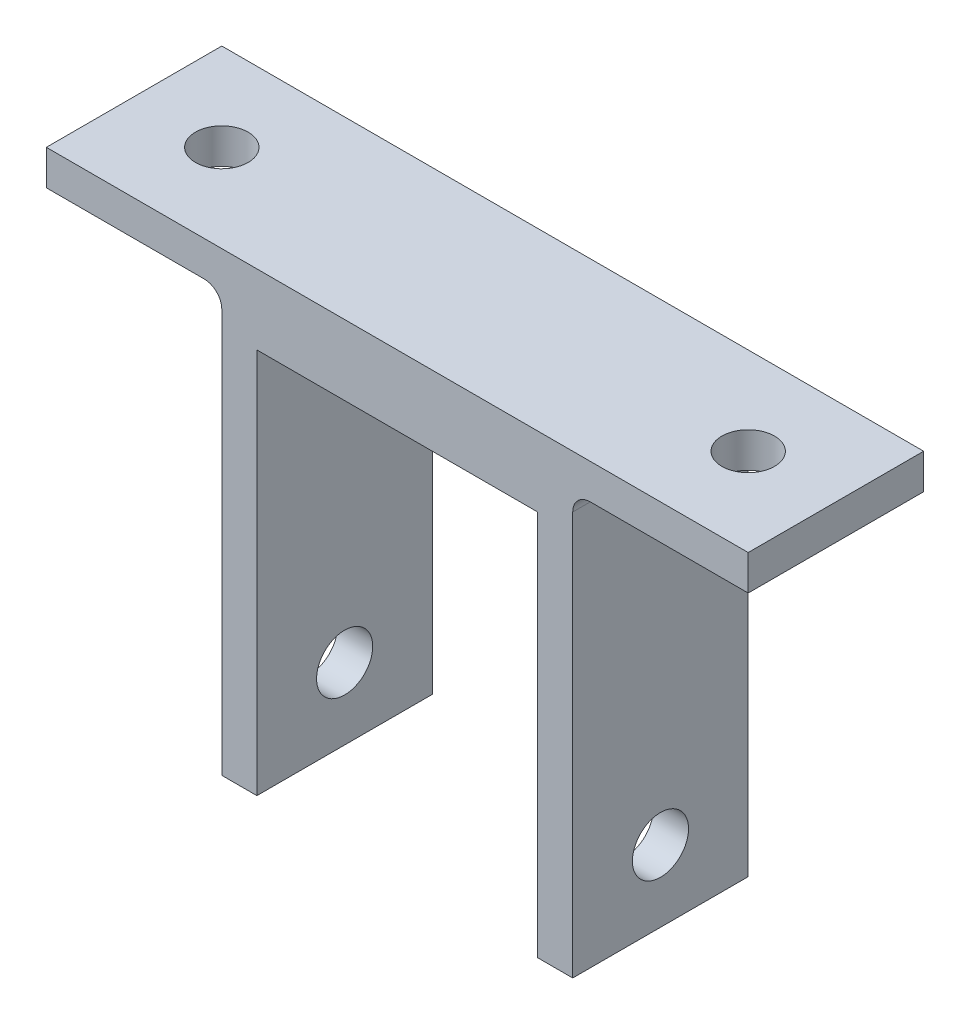
ISO-10303-21;
HEADER;
FILE_DESCRIPTION(('STEP AP214'),'2;1');
FILE_NAME('part.step','',(''),(''),'','','');
FILE_SCHEMA(('AUTOMOTIVE_DESIGN { 1 0 10303 214 1 1 1 1 }'));
ENDSEC;
DATA;
#1=APPLICATION_CONTEXT('core data for automotive mechanical design processes');
#2=APPLICATION_PROTOCOL_DEFINITION('international standard','automotive_design',2000,#1);
#3=PRODUCT_CONTEXT('',#1,'mechanical');
#4=PRODUCT('Part','Part','',(#3));
#5=PRODUCT_RELATED_PRODUCT_CATEGORY('part','',(#4));
#6=PRODUCT_DEFINITION_FORMATION('','',#4);
#7=PRODUCT_DEFINITION_CONTEXT('part definition',#1,'design');
#8=PRODUCT_DEFINITION('design','',#6,#7);
#9=PRODUCT_DEFINITION_SHAPE('','',#8);
#10=(LENGTH_UNIT() NAMED_UNIT(*) SI_UNIT(.MILLI.,.METRE.));
#11=(NAMED_UNIT(*) PLANE_ANGLE_UNIT() SI_UNIT($,.RADIAN.));
#12=(NAMED_UNIT(*) SI_UNIT($,.STERADIAN.) SOLID_ANGLE_UNIT());
#13=UNCERTAINTY_MEASURE_WITH_UNIT(LENGTH_MEASURE(1.E-05),#10,'distance_accuracy_value','');
#14=(GEOMETRIC_REPRESENTATION_CONTEXT(3) GLOBAL_UNCERTAINTY_ASSIGNED_CONTEXT((#13)) GLOBAL_UNIT_ASSIGNED_CONTEXT((#10,
#11,#12)) REPRESENTATION_CONTEXT('',''));
#15=CARTESIAN_POINT('',(0.,0.,0.));
#16=DIRECTION('',(0.,0.,1.));
#17=DIRECTION('',(1.,0.,0.));
#18=AXIS2_PLACEMENT_3D('',#15,#16,#17);
#19=CARTESIAN_POINT('',(8.,-14.,10.));
#20=DIRECTION('',(0.,1.,0.));
#21=DIRECTION('',(0.,0.,1.));
#22=AXIS2_PLACEMENT_3D('',#19,#20,#21);
#23=PLANE('',#22);
#24=DIRECTION('',(1.,0.,0.));
#25=VECTOR('',#24,1.);
#26=CARTESIAN_POINT('',(8.,-14.,0.));
#27=LINE('',#26,#25);
#28=CARTESIAN_POINT('',(8.,-14.,0.));
#29=VERTEX_POINT('',#28);
#30=CARTESIAN_POINT('',(10.,-14.,0.));
#31=VERTEX_POINT('',#30);
#32=EDGE_CURVE('E159',#29,#31,#27,.T.);
#33=ORIENTED_EDGE('',*,*,#32,.T.);
#34=DIRECTION('',(0.,0.,-1.));
#35=VECTOR('',#34,1.);
#36=CARTESIAN_POINT('',(10.,-14.,10.));
#37=LINE('',#36,#35);
#38=CARTESIAN_POINT('',(10.,-14.,10.));
#39=VERTEX_POINT('',#38);
#40=EDGE_CURVE('E209',#39,#31,#37,.T.);
#41=ORIENTED_EDGE('',*,*,#40,.F.);
#42=DIRECTION('',(1.,0.,0.));
#43=VECTOR('',#42,1.);
#44=CARTESIAN_POINT('',(8.,-14.,10.));
#45=LINE('',#44,#43);
#46=CARTESIAN_POINT('',(8.,-14.,10.));
#47=VERTEX_POINT('',#46);
#48=EDGE_CURVE('E170',#47,#39,#45,.T.);
#49=ORIENTED_EDGE('',*,*,#48,.F.);
#50=DIRECTION('',(0.,0.,-1.));
#51=VECTOR('',#50,1.);
#52=CARTESIAN_POINT('',(8.,-14.,10.));
#53=LINE('',#52,#51);
#54=EDGE_CURVE('E212',#47,#29,#53,.T.);
#55=ORIENTED_EDGE('',*,*,#54,.T.);
#56=EDGE_LOOP('',(#33,#41,#49,#55));
#57=FACE_BOUND('',#56,.T.);
#58=ADVANCED_FACE('F32',(#57),#23,.F.);
#59=CARTESIAN_POINT('',(10.,10.,10.));
#60=DIRECTION('',(-1.,0.,0.));
#61=DIRECTION('',(0.,0.,1.));
#62=AXIS2_PLACEMENT_3D('',#59,#60,#61);
#63=PLANE('',#62);
#64=CARTESIAN_POINT('',(10.,-9.93051236855531,5.));
#65=DIRECTION('',(1.,0.,0.));
#66=DIRECTION('',(0.,0.,-1.));
#67=AXIS2_PLACEMENT_3D('',#64,#65,#66);
#68=CIRCLE('',#67,1.6);
#69=CARTESIAN_POINT('',(10.,-9.93051236855531,3.4));
#70=VERTEX_POINT('',#69);
#71=EDGE_CURVE('E306',#70,#70,#68,.T.);
#72=ORIENTED_EDGE('',*,*,#71,.F.);
#73=EDGE_LOOP('',(#72));
#74=FACE_BOUND('',#73,.T.);
#75=DIRECTION('',(0.,1.,0.));
#76=VECTOR('',#75,1.);
#77=CARTESIAN_POINT('',(10.,10.,0.));
#78=LINE('',#77,#76);
#79=CARTESIAN_POINT('',(10.,9.,0.));
#80=VERTEX_POINT('',#79);
#81=EDGE_CURVE('E162',#31,#80,#78,.T.);
#82=ORIENTED_EDGE('',*,*,#81,.T.);
#83=DIRECTION('',(0.,0.,-1.));
#84=VECTOR('',#83,1.);
#85=CARTESIAN_POINT('',(10.,9.,10.));
#86=LINE('',#85,#84);
#87=CARTESIAN_POINT('',(9.99999999999998,9.,10.));
#88=VERTEX_POINT('',#87);
#89=EDGE_CURVE('E218',#80,#88,#86,.F.);
#90=ORIENTED_EDGE('',*,*,#89,.T.);
#91=DIRECTION('',(0.,1.,0.));
#92=VECTOR('',#91,1.);
#93=CARTESIAN_POINT('',(10.,-10.,10.));
#94=LINE('',#93,#92);
#95=EDGE_CURVE('E173',#39,#88,#94,.T.);
#96=ORIENTED_EDGE('',*,*,#95,.F.);
#97=ORIENTED_EDGE('',*,*,#40,.T.);
#98=EDGE_LOOP('',(#82,#90,#96,#97));
#99=FACE_BOUND('',#98,.T.);
#100=ADVANCED_FACE('F248',(#74,#99),#63,.F.);
#101=CARTESIAN_POINT('',(-10.,-10.,10.));
#102=DIRECTION('',(1.,0.,0.));
#103=DIRECTION('',(0.,0.,-1.));
#104=AXIS2_PLACEMENT_3D('',#101,#102,#103);
#105=PLANE('',#104);
#106=CARTESIAN_POINT('',(-10.,-9.93051236855531,5.));
#107=DIRECTION('',(1.,0.,0.));
#108=DIRECTION('',(0.,0.,-1.));
#109=AXIS2_PLACEMENT_3D('',#106,#107,#108);
#110=CIRCLE('',#109,1.6);
#111=CARTESIAN_POINT('',(-10.,-9.93051236855531,3.4));
#112=VERTEX_POINT('',#111);
#113=EDGE_CURVE('E298',#112,#112,#110,.T.);
#114=ORIENTED_EDGE('',*,*,#113,.T.);
#115=EDGE_LOOP('',(#114));
#116=FACE_BOUND('',#115,.T.);
#117=DIRECTION('',(0.,-1.,0.));
#118=VECTOR('',#117,1.);
#119=CARTESIAN_POINT('',(-10.,10.,10.));
#120=LINE('',#119,#118);
#121=CARTESIAN_POINT('',(-10.,9.,10.));
#122=VERTEX_POINT('',#121);
#123=CARTESIAN_POINT('',(-10.,-14.,10.));
#124=VERTEX_POINT('',#123);
#125=EDGE_CURVE('E176',#122,#124,#120,.T.);
#126=ORIENTED_EDGE('',*,*,#125,.F.);
#127=DIRECTION('',(0.,0.,-1.));
#128=VECTOR('',#127,1.);
#129=CARTESIAN_POINT('',(-10.,9.,0.));
#130=LINE('',#129,#128);
#131=CARTESIAN_POINT('',(-10.,9.,0.));
#132=VERTEX_POINT('',#131);
#133=EDGE_CURVE('E220',#122,#132,#130,.T.);
#134=ORIENTED_EDGE('',*,*,#133,.T.);
#135=DIRECTION('',(0.,-1.,0.));
#136=VECTOR('',#135,1.);
#137=CARTESIAN_POINT('',(-10.,-10.,0.));
#138=LINE('',#137,#136);
#139=CARTESIAN_POINT('',(-10.,-14.,0.));
#140=VERTEX_POINT('',#139);
#141=EDGE_CURVE('E188',#132,#140,#138,.T.);
#142=ORIENTED_EDGE('',*,*,#141,.T.);
#143=DIRECTION('',(0.,0.,-1.));
#144=VECTOR('',#143,1.);
#145=CARTESIAN_POINT('',(-10.,-14.,10.));
#146=LINE('',#145,#144);
#147=EDGE_CURVE('E206',#124,#140,#146,.T.);
#148=ORIENTED_EDGE('',*,*,#147,.F.);
#149=EDGE_LOOP('',(#126,#134,#142,#148));
#150=FACE_BOUND('',#149,.T.);
#151=ADVANCED_FACE('F272',(#116,#150),#105,.F.);
#152=CARTESIAN_POINT('',(-10.,-14.,10.));
#153=DIRECTION('',(0.,1.,0.));
#154=DIRECTION('',(0.,0.,1.));
#155=AXIS2_PLACEMENT_3D('',#152,#153,#154);
#156=PLANE('',#155);
#157=DIRECTION('',(1.,0.,0.));
#158=VECTOR('',#157,1.);
#159=CARTESIAN_POINT('',(-10.,-14.,0.));
#160=LINE('',#159,#158);
#161=CARTESIAN_POINT('',(-8.,-14.,0.));
#162=VERTEX_POINT('',#161);
#163=EDGE_CURVE('E190',#140,#162,#160,.T.);
#164=ORIENTED_EDGE('',*,*,#163,.T.);
#165=DIRECTION('',(0.,0.,-1.));
#166=VECTOR('',#165,1.);
#167=CARTESIAN_POINT('',(-8.,-14.,10.));
#168=LINE('',#167,#166);
#169=CARTESIAN_POINT('',(-8.,-14.,10.));
#170=VERTEX_POINT('',#169);
#171=EDGE_CURVE('E203',#170,#162,#168,.T.);
#172=ORIENTED_EDGE('',*,*,#171,.F.);
#173=DIRECTION('',(1.,0.,0.));
#174=VECTOR('',#173,1.);
#175=CARTESIAN_POINT('',(-10.,-14.,10.));
#176=LINE('',#175,#174);
#177=EDGE_CURVE('E178',#124,#170,#176,.T.);
#178=ORIENTED_EDGE('',*,*,#177,.F.);
#179=ORIENTED_EDGE('',*,*,#147,.T.);
#180=EDGE_LOOP('',(#164,#172,#178,#179));
#181=FACE_BOUND('',#180,.T.);
#182=ADVANCED_FACE('F267',(#181),#156,.F.);
#183=CARTESIAN_POINT('',(-8.,8.,10.));
#184=DIRECTION('',(-1.,0.,0.));
#185=DIRECTION('',(0.,-1.,0.));
#186=AXIS2_PLACEMENT_3D('',#183,#184,#185);
#187=PLANE('',#186);
#188=CARTESIAN_POINT('',(-8.,-9.93051236855531,5.));
#189=DIRECTION('',(-1.,0.,0.));
#190=DIRECTION('',(0.,-1.,0.));
#191=AXIS2_PLACEMENT_3D('',#188,#189,#190);
#192=CIRCLE('',#191,1.6);
#193=CARTESIAN_POINT('',(-8.,-11.5305123685553,5.));
#194=VERTEX_POINT('',#193);
#195=EDGE_CURVE('E303',#194,#194,#192,.T.);
#196=ORIENTED_EDGE('',*,*,#195,.T.);
#197=EDGE_LOOP('',(#196));
#198=FACE_BOUND('',#197,.T.);
#199=DIRECTION('',(0.,1.,0.));
#200=VECTOR('',#199,1.);
#201=CARTESIAN_POINT('',(-8.,8.,0.));
#202=LINE('',#201,#200);
#203=CARTESIAN_POINT('',(-8.,8.,0.));
#204=VERTEX_POINT('',#203);
#205=EDGE_CURVE('E193',#162,#204,#202,.T.);
#206=ORIENTED_EDGE('',*,*,#205,.T.);
#207=DIRECTION('',(0.,0.,-1.));
#208=VECTOR('',#207,1.);
#209=CARTESIAN_POINT('',(-8.,8.,10.));
#210=LINE('',#209,#208);
#211=CARTESIAN_POINT('',(-8.,8.,10.));
#212=VERTEX_POINT('',#211);
#213=EDGE_CURVE('E200',#212,#204,#210,.T.);
#214=ORIENTED_EDGE('',*,*,#213,.F.);
#215=DIRECTION('',(0.,1.,0.));
#216=VECTOR('',#215,1.);
#217=CARTESIAN_POINT('',(-8.,-8.,10.));
#218=LINE('',#217,#216);
#219=EDGE_CURVE('E180',#170,#212,#218,.T.);
#220=ORIENTED_EDGE('',*,*,#219,.F.);
#221=ORIENTED_EDGE('',*,*,#171,.T.);
#222=EDGE_LOOP('',(#206,#214,#220,#221));
#223=FACE_BOUND('',#222,.T.);
#224=ADVANCED_FACE('F263',(#198,#223),#187,.F.);
#225=CARTESIAN_POINT('',(-8.,8.,10.));
#226=DIRECTION('',(0.,1.,0.));
#227=DIRECTION('',(0.,0.,1.));
#228=AXIS2_PLACEMENT_3D('',#225,#226,#227);
#229=PLANE('',#228);
#230=DIRECTION('',(1.,0.,0.));
#231=VECTOR('',#230,1.);
#232=CARTESIAN_POINT('',(-8.,8.,0.));
#233=LINE('',#232,#231);
#234=CARTESIAN_POINT('',(8.,8.,0.));
#235=VERTEX_POINT('',#234);
#236=EDGE_CURVE('E195',#204,#235,#233,.T.);
#237=ORIENTED_EDGE('',*,*,#236,.T.);
#238=DIRECTION('',(0.,0.,-1.));
#239=VECTOR('',#238,1.);
#240=CARTESIAN_POINT('',(8.,8.,10.));
#241=LINE('',#240,#239);
#242=CARTESIAN_POINT('',(8.,8.,10.));
#243=VERTEX_POINT('',#242);
#244=EDGE_CURVE('E184',#243,#235,#241,.T.);
#245=ORIENTED_EDGE('',*,*,#244,.F.);
#246=DIRECTION('',(1.,0.,0.));
#247=VECTOR('',#246,1.);
#248=CARTESIAN_POINT('',(-8.,8.,10.));
#249=LINE('',#248,#247);
#250=EDGE_CURVE('E182',#212,#243,#249,.T.);
#251=ORIENTED_EDGE('',*,*,#250,.F.);
#252=ORIENTED_EDGE('',*,*,#213,.T.);
#253=EDGE_LOOP('',(#237,#245,#251,#252));
#254=FACE_BOUND('',#253,.T.);
#255=ADVANCED_FACE('F259',(#254),#229,.F.);
#256=CARTESIAN_POINT('',(8.,8.,10.));
#257=DIRECTION('',(1.,0.,0.));
#258=DIRECTION('',(0.,1.,0.));
#259=AXIS2_PLACEMENT_3D('',#256,#257,#258);
#260=PLANE('',#259);
#261=CARTESIAN_POINT('',(8.00000000000001,-9.93051236855531,5.));
#262=DIRECTION('',(1.,0.,0.));
#263=DIRECTION('',(0.,1.,0.));
#264=AXIS2_PLACEMENT_3D('',#261,#262,#263);
#265=CIRCLE('',#264,1.6);
#266=CARTESIAN_POINT('',(8.00000000000001,-8.33051236855531,5.));
#267=VERTEX_POINT('',#266);
#268=EDGE_CURVE('E36',#267,#267,#265,.T.);
#269=ORIENTED_EDGE('',*,*,#268,.T.);
#270=EDGE_LOOP('',(#269));
#271=FACE_BOUND('',#270,.T.);
#272=DIRECTION('',(0.,-1.,0.));
#273=VECTOR('',#272,1.);
#274=CARTESIAN_POINT('',(8.,8.,0.));
#275=LINE('',#274,#273);
#276=EDGE_CURVE('E171',#235,#29,#275,.T.);
#277=ORIENTED_EDGE('',*,*,#276,.T.);
#278=ORIENTED_EDGE('',*,*,#54,.F.);
#279=DIRECTION('',(0.,-1.,0.));
#280=VECTOR('',#279,1.);
#281=CARTESIAN_POINT('',(8.,-8.,10.));
#282=LINE('',#281,#280);
#283=EDGE_CURVE('E168',#243,#47,#282,.T.);
#284=ORIENTED_EDGE('',*,*,#283,.F.);
#285=ORIENTED_EDGE('',*,*,#244,.T.);
#286=EDGE_LOOP('',(#277,#278,#284,#285));
#287=FACE_BOUND('',#286,.T.);
#288=ADVANCED_FACE('F255',(#271,#287),#260,.F.);
#289=CARTESIAN_POINT('',(0.,0.,10.));
#290=DIRECTION('',(0.,0.,1.));
#291=DIRECTION('',(1.,0.,0.));
#292=AXIS2_PLACEMENT_3D('',#289,#290,#291);
#293=PLANE('',#292);
#294=ORIENTED_EDGE('',*,*,#283,.T.);
#295=ORIENTED_EDGE('',*,*,#48,.T.);
#296=ORIENTED_EDGE('',*,*,#95,.T.);
#297=CARTESIAN_POINT('',(11.,9.,10.));
#298=DIRECTION('',(0.,0.,1.));
#299=DIRECTION('',(1.,0.,0.));
#300=AXIS2_PLACEMENT_3D('',#297,#298,#299);
#301=CIRCLE('',#300,1.);
#302=CARTESIAN_POINT('',(11.,10.,10.));
#303=VERTEX_POINT('',#302);
#304=EDGE_CURVE('E226',#88,#303,#301,.F.);
#305=ORIENTED_EDGE('',*,*,#304,.T.);
#306=DIRECTION('',(1.,0.,0.));
#307=VECTOR('',#306,1.);
#308=CARTESIAN_POINT('',(-20.,10.,10.));
#309=LINE('',#308,#307);
#310=CARTESIAN_POINT('',(20.,10.,10.));
#311=VERTEX_POINT('',#310);
#312=EDGE_CURVE('E230',#303,#311,#309,.T.);
#313=ORIENTED_EDGE('',*,*,#312,.T.);
#314=DIRECTION('',(0.,-1.,0.));
#315=VECTOR('',#314,1.);
#316=CARTESIAN_POINT('',(20.,12.,10.));
#317=LINE('',#316,#315);
#318=CARTESIAN_POINT('',(20.,12.,10.));
#319=VERTEX_POINT('',#318);
#320=EDGE_CURVE('E140',#319,#311,#317,.T.);
#321=ORIENTED_EDGE('',*,*,#320,.F.);
#322=DIRECTION('',(1.,0.,0.));
#323=VECTOR('',#322,1.);
#324=CARTESIAN_POINT('',(-20.,12.,10.));
#325=LINE('',#324,#323);
#326=CARTESIAN_POINT('',(-20.,12.,10.));
#327=VERTEX_POINT('',#326);
#328=EDGE_CURVE('E132',#327,#319,#325,.T.);
#329=ORIENTED_EDGE('',*,*,#328,.F.);
#330=DIRECTION('',(0.,-1.,0.));
#331=VECTOR('',#330,1.);
#332=CARTESIAN_POINT('',(-20.,12.,10.));
#333=LINE('',#332,#331);
#334=CARTESIAN_POINT('',(-20.,10.,10.));
#335=VERTEX_POINT('',#334);
#336=EDGE_CURVE('E137',#327,#335,#333,.T.);
#337=ORIENTED_EDGE('',*,*,#336,.T.);
#338=CARTESIAN_POINT('',(-11.,10.,10.));
#339=VERTEX_POINT('',#338);
#340=EDGE_CURVE('E241',#335,#339,#309,.T.);
#341=ORIENTED_EDGE('',*,*,#340,.T.);
#342=CARTESIAN_POINT('',(-11.,9.,10.));
#343=DIRECTION('',(0.,0.,1.));
#344=DIRECTION('',(1.,0.,0.));
#345=AXIS2_PLACEMENT_3D('',#342,#343,#344);
#346=CIRCLE('',#345,1.);
#347=EDGE_CURVE('E11',#339,#122,#346,.F.);
#348=ORIENTED_EDGE('',*,*,#347,.T.);
#349=ORIENTED_EDGE('',*,*,#125,.T.);
#350=ORIENTED_EDGE('',*,*,#177,.T.);
#351=ORIENTED_EDGE('',*,*,#219,.T.);
#352=ORIENTED_EDGE('',*,*,#250,.T.);
#353=EDGE_LOOP('',(#294,#295,#296,#305,#313,#321,#329,#337,#341,#348,#349,#350,#351,#352));
#354=FACE_BOUND('',#353,.T.);
#355=ADVANCED_FACE('F135',(#354),#293,.T.);
#356=CARTESIAN_POINT('',(0.,0.,0.));
#357=DIRECTION('',(0.,0.,1.));
#358=DIRECTION('',(1.,0.,0.));
#359=AXIS2_PLACEMENT_3D('',#356,#357,#358);
#360=PLANE('',#359);
#361=ORIENTED_EDGE('',*,*,#32,.F.);
#362=ORIENTED_EDGE('',*,*,#276,.F.);
#363=ORIENTED_EDGE('',*,*,#236,.F.);
#364=ORIENTED_EDGE('',*,*,#205,.F.);
#365=ORIENTED_EDGE('',*,*,#163,.F.);
#366=ORIENTED_EDGE('',*,*,#141,.F.);
#367=CARTESIAN_POINT('',(-11.,9.,0.));
#368=DIRECTION('',(0.,0.,1.));
#369=DIRECTION('',(1.,0.,0.));
#370=AXIS2_PLACEMENT_3D('',#367,#368,#369);
#371=CIRCLE('',#370,1.);
#372=CARTESIAN_POINT('',(-11.,10.,0.));
#373=VERTEX_POINT('',#372);
#374=EDGE_CURVE('E41',#132,#373,#371,.T.);
#375=ORIENTED_EDGE('',*,*,#374,.T.);
#376=DIRECTION('',(-1.,0.,0.));
#377=VECTOR('',#376,1.);
#378=CARTESIAN_POINT('',(-20.,10.,0.));
#379=LINE('',#378,#377);
#380=CARTESIAN_POINT('',(-20.,10.,0.));
#381=VERTEX_POINT('',#380);
#382=EDGE_CURVE('E276',#373,#381,#379,.T.);
#383=ORIENTED_EDGE('',*,*,#382,.T.);
#384=DIRECTION('',(0.,-1.,0.));
#385=VECTOR('',#384,1.);
#386=CARTESIAN_POINT('',(-20.,12.,0.));
#387=LINE('',#386,#385);
#388=CARTESIAN_POINT('',(-20.,12.,0.));
#389=VERTEX_POINT('',#388);
#390=EDGE_CURVE('E282',#389,#381,#387,.T.);
#391=ORIENTED_EDGE('',*,*,#390,.F.);
#392=DIRECTION('',(-1.,0.,0.));
#393=VECTOR('',#392,1.);
#394=CARTESIAN_POINT('',(-20.,12.,0.));
#395=LINE('',#394,#393);
#396=CARTESIAN_POINT('',(20.,12.,0.));
#397=VERTEX_POINT('',#396);
#398=EDGE_CURVE('E150',#397,#389,#395,.T.);
#399=ORIENTED_EDGE('',*,*,#398,.F.);
#400=DIRECTION('',(0.,-1.,0.));
#401=VECTOR('',#400,1.);
#402=CARTESIAN_POINT('',(20.,12.,0.));
#403=LINE('',#402,#401);
#404=CARTESIAN_POINT('',(20.,10.,0.));
#405=VERTEX_POINT('',#404);
#406=EDGE_CURVE('E164',#397,#405,#403,.T.);
#407=ORIENTED_EDGE('',*,*,#406,.T.);
#408=CARTESIAN_POINT('',(11.,10.,0.));
#409=VERTEX_POINT('',#408);
#410=EDGE_CURVE('E154',#405,#409,#379,.T.);
#411=ORIENTED_EDGE('',*,*,#410,.T.);
#412=CARTESIAN_POINT('',(11.,9.,0.));
#413=DIRECTION('',(0.,0.,1.));
#414=DIRECTION('',(1.,0.,0.));
#415=AXIS2_PLACEMENT_3D('',#412,#413,#414);
#416=CIRCLE('',#415,1.);
#417=EDGE_CURVE('E224',#409,#80,#416,.T.);
#418=ORIENTED_EDGE('',*,*,#417,.T.);
#419=ORIENTED_EDGE('',*,*,#81,.F.);
#420=EDGE_LOOP('',(#361,#362,#363,#364,#365,#366,#375,#383,#391,#399,#407,#411,#418,#419));
#421=FACE_BOUND('',#420,.T.);
#422=ADVANCED_FACE('F245',(#421),#360,.F.);
#423=CARTESIAN_POINT('',(0.,10.,0.));
#424=DIRECTION('',(0.,1.,0.));
#425=DIRECTION('',(0.,0.,1.));
#426=AXIS2_PLACEMENT_3D('',#423,#424,#425);
#427=PLANE('',#426);
#428=CARTESIAN_POINT('',(15.,10.,4.99999999999999));
#429=DIRECTION('',(0.,1.,0.));
#430=DIRECTION('',(0.,0.,-1.));
#431=AXIS2_PLACEMENT_3D('',#428,#429,#430);
#432=CIRCLE('',#431,1.5);
#433=CARTESIAN_POINT('',(15.,10.,3.49999999999999));
#434=VERTEX_POINT('',#433);
#435=EDGE_CURVE('E295',#434,#434,#432,.T.);
#436=ORIENTED_EDGE('',*,*,#435,.T.);
#437=EDGE_LOOP('',(#436));
#438=FACE_BOUND('',#437,.T.);
#439=ORIENTED_EDGE('',*,*,#312,.F.);
#440=DIRECTION('',(0.,0.,-1.));
#441=VECTOR('',#440,1.);
#442=CARTESIAN_POINT('',(11.,10.,0.));
#443=LINE('',#442,#441);
#444=EDGE_CURVE('E215',#303,#409,#443,.T.);
#445=ORIENTED_EDGE('',*,*,#444,.T.);
#446=ORIENTED_EDGE('',*,*,#410,.F.);
#447=DIRECTION('',(0.,0.,-1.));
#448=VECTOR('',#447,1.);
#449=CARTESIAN_POINT('',(20.,10.,0.));
#450=LINE('',#449,#448);
#451=EDGE_CURVE('E240',#311,#405,#450,.T.);
#452=ORIENTED_EDGE('',*,*,#451,.F.);
#453=EDGE_LOOP('',(#439,#445,#446,#452));
#454=FACE_BOUND('',#453,.T.);
#455=ADVANCED_FACE('F237',(#438,#454),#427,.F.);
#456=CARTESIAN_POINT('',(0.,12.,0.));
#457=DIRECTION('',(0.,1.,0.));
#458=DIRECTION('',(0.,0.,1.));
#459=AXIS2_PLACEMENT_3D('',#456,#457,#458);
#460=PLANE('',#459);
#461=CARTESIAN_POINT('',(-15.,12.,5.));
#462=DIRECTION('',(0.,1.,0.));
#463=DIRECTION('',(0.,0.,1.));
#464=AXIS2_PLACEMENT_3D('',#461,#462,#463);
#465=CIRCLE('',#464,1.5);
#466=CARTESIAN_POINT('',(-15.,12.,6.5));
#467=VERTEX_POINT('',#466);
#468=EDGE_CURVE('E291',#467,#467,#465,.T.);
#469=ORIENTED_EDGE('',*,*,#468,.F.);
#470=EDGE_LOOP('',(#469));
#471=FACE_BOUND('',#470,.T.);
#472=DIRECTION('',(0.,0.,1.));
#473=VECTOR('',#472,1.);
#474=CARTESIAN_POINT('',(-20.,12.,0.));
#475=LINE('',#474,#473);
#476=EDGE_CURVE('E144',#389,#327,#475,.T.);
#477=ORIENTED_EDGE('',*,*,#476,.T.);
#478=ORIENTED_EDGE('',*,*,#328,.T.);
#479=DIRECTION('',(0.,0.,-1.));
#480=VECTOR('',#479,1.);
#481=CARTESIAN_POINT('',(20.,12.,0.));
#482=LINE('',#481,#480);
#483=EDGE_CURVE('E143',#319,#397,#482,.T.);
#484=ORIENTED_EDGE('',*,*,#483,.T.);
#485=ORIENTED_EDGE('',*,*,#398,.T.);
#486=EDGE_LOOP('',(#477,#478,#484,#485));
#487=FACE_BOUND('',#486,.T.);
#488=CARTESIAN_POINT('',(15.,12.,4.99999999999999));
#489=DIRECTION('',(0.,1.,0.));
#490=DIRECTION('',(0.,0.,-1.));
#491=AXIS2_PLACEMENT_3D('',#488,#489,#490);
#492=CIRCLE('',#491,1.5);
#493=CARTESIAN_POINT('',(15.,12.,3.49999999999999));
#494=VERTEX_POINT('',#493);
#495=EDGE_CURVE('E292',#494,#494,#492,.T.);
#496=ORIENTED_EDGE('',*,*,#495,.F.);
#497=EDGE_LOOP('',(#496));
#498=FACE_BOUND('',#497,.T.);
#499=ADVANCED_FACE('F147',(#471,#487,#498),#460,.T.);
#500=ORIENTED_EDGE('',*,*,#382,.F.);
#501=DIRECTION('',(0.,0.,-1.));
#502=VECTOR('',#501,1.);
#503=CARTESIAN_POINT('',(-11.,10.,10.));
#504=LINE('',#503,#502);
#505=EDGE_CURVE('E54',#373,#339,#504,.F.);
#506=ORIENTED_EDGE('',*,*,#505,.T.);
#507=ORIENTED_EDGE('',*,*,#340,.F.);
#508=DIRECTION('',(0.,0.,1.));
#509=VECTOR('',#508,1.);
#510=CARTESIAN_POINT('',(-20.,10.,0.));
#511=LINE('',#510,#509);
#512=EDGE_CURVE('E158',#381,#335,#511,.T.);
#513=ORIENTED_EDGE('',*,*,#512,.F.);
#514=EDGE_LOOP('',(#500,#506,#507,#513));
#515=FACE_BOUND('',#514,.T.);
#516=CARTESIAN_POINT('',(-15.,10.,5.));
#517=DIRECTION('',(0.,1.,0.));
#518=DIRECTION('',(0.,0.,1.));
#519=AXIS2_PLACEMENT_3D('',#516,#517,#518);
#520=CIRCLE('',#519,1.5);
#521=CARTESIAN_POINT('',(-15.,10.,6.5));
#522=VERTEX_POINT('',#521);
#523=EDGE_CURVE('E288',#522,#522,#520,.T.);
#524=ORIENTED_EDGE('',*,*,#523,.T.);
#525=EDGE_LOOP('',(#524));
#526=FACE_BOUND('',#525,.T.);
#527=ADVANCED_FACE('F348',(#515,#526),#427,.F.);
#528=CARTESIAN_POINT('',(-20.,12.,0.));
#529=DIRECTION('',(1.,0.,0.));
#530=DIRECTION('',(0.,0.,-1.));
#531=AXIS2_PLACEMENT_3D('',#528,#529,#530);
#532=PLANE('',#531);
#533=ORIENTED_EDGE('',*,*,#512,.T.);
#534=ORIENTED_EDGE('',*,*,#336,.F.);
#535=ORIENTED_EDGE('',*,*,#476,.F.);
#536=ORIENTED_EDGE('',*,*,#390,.T.);
#537=EDGE_LOOP('',(#533,#534,#535,#536));
#538=FACE_BOUND('',#537,.T.);
#539=ADVANCED_FACE('F156',(#538),#532,.F.);
#540=CARTESIAN_POINT('',(20.,12.,0.));
#541=DIRECTION('',(-1.,0.,0.));
#542=DIRECTION('',(0.,0.,1.));
#543=AXIS2_PLACEMENT_3D('',#540,#541,#542);
#544=PLANE('',#543);
#545=ORIENTED_EDGE('',*,*,#451,.T.);
#546=ORIENTED_EDGE('',*,*,#406,.F.);
#547=ORIENTED_EDGE('',*,*,#483,.F.);
#548=ORIENTED_EDGE('',*,*,#320,.T.);
#549=EDGE_LOOP('',(#545,#546,#547,#548));
#550=FACE_BOUND('',#549,.T.);
#551=ADVANCED_FACE('F285',(#550),#544,.F.);
#552=CARTESIAN_POINT('',(-15.,12.,5.));
#553=DIRECTION('',(0.,-1.,0.));
#554=DIRECTION('',(0.,0.,-1.));
#555=AXIS2_PLACEMENT_3D('',#552,#553,#554);
#556=CYLINDRICAL_SURFACE('',#555,1.5);
#557=ORIENTED_EDGE('',*,*,#468,.T.);
#558=EDGE_LOOP('',(#557));
#559=FACE_BOUND('',#558,.T.);
#560=ORIENTED_EDGE('',*,*,#523,.F.);
#561=EDGE_LOOP('',(#560));
#562=FACE_BOUND('',#561,.T.);
#563=ADVANCED_FACE('F337',(#559,#562),#556,.F.);
#564=CARTESIAN_POINT('',(15.,12.,4.99999999999999));
#565=DIRECTION('',(0.,-1.,0.));
#566=DIRECTION('',(0.,0.,-1.));
#567=AXIS2_PLACEMENT_3D('',#564,#565,#566);
#568=CYLINDRICAL_SURFACE('',#567,1.5);
#569=ORIENTED_EDGE('',*,*,#495,.T.);
#570=EDGE_LOOP('',(#569));
#571=FACE_BOUND('',#570,.T.);
#572=ORIENTED_EDGE('',*,*,#435,.F.);
#573=EDGE_LOOP('',(#572));
#574=FACE_BOUND('',#573,.T.);
#575=ADVANCED_FACE('F333',(#571,#574),#568,.F.);
#576=CARTESIAN_POINT('',(11.,9.,0.));
#577=DIRECTION('',(0.,0.,1.));
#578=DIRECTION('',(1.,0.,0.));
#579=AXIS2_PLACEMENT_3D('',#576,#577,#578);
#580=CYLINDRICAL_SURFACE('',#579,1.);
#581=ORIENTED_EDGE('',*,*,#304,.F.);
#582=ORIENTED_EDGE('',*,*,#89,.F.);
#583=ORIENTED_EDGE('',*,*,#417,.F.);
#584=ORIENTED_EDGE('',*,*,#444,.F.);
#585=EDGE_LOOP('',(#581,#582,#583,#584));
#586=FACE_BOUND('',#585,.T.);
#587=ADVANCED_FACE('F243',(#586),#580,.F.);
#588=CARTESIAN_POINT('',(-11.,9.,10.));
#589=DIRECTION('',(0.,0.,1.));
#590=DIRECTION('',(1.,0.,0.));
#591=AXIS2_PLACEMENT_3D('',#588,#589,#590);
#592=CYLINDRICAL_SURFACE('',#591,1.);
#593=ORIENTED_EDGE('',*,*,#347,.F.);
#594=ORIENTED_EDGE('',*,*,#505,.F.);
#595=ORIENTED_EDGE('',*,*,#374,.F.);
#596=ORIENTED_EDGE('',*,*,#133,.F.);
#597=EDGE_LOOP('',(#593,#594,#595,#596));
#598=FACE_BOUND('',#597,.T.);
#599=ADVANCED_FACE('F34',(#598),#592,.F.);
#600=CARTESIAN_POINT('',(-20.,-9.93051236855531,5.));
#601=DIRECTION('',(1.,0.,0.));
#602=DIRECTION('',(0.,0.,-1.));
#603=AXIS2_PLACEMENT_3D('',#600,#601,#602);
#604=CYLINDRICAL_SURFACE('',#603,1.6);
#605=ORIENTED_EDGE('',*,*,#71,.T.);
#606=EDGE_LOOP('',(#605));
#607=FACE_BOUND('',#606,.T.);
#608=ORIENTED_EDGE('',*,*,#268,.F.);
#609=EDGE_LOOP('',(#608));
#610=FACE_BOUND('',#609,.T.);
#611=ADVANCED_FACE('F314',(#607,#610),#604,.F.);
#612=ORIENTED_EDGE('',*,*,#195,.F.);
#613=EDGE_LOOP('',(#612));
#614=FACE_BOUND('',#613,.T.);
#615=ORIENTED_EDGE('',*,*,#113,.F.);
#616=EDGE_LOOP('',(#615));
#617=FACE_BOUND('',#616,.T.);
#618=ADVANCED_FACE('F316',(#614,#617),#604,.F.);
#619=CLOSED_SHELL('',(#58,#100,#151,#182,#224,#255,#288,#355,#422,#455,#499,#527,#539,#551,#563,
#575,#587,#599,#611,#618));
#620=MANIFOLD_SOLID_BREP('B2',#619);
#621=ADVANCED_BREP_SHAPE_REPRESENTATION('',(#18,#620),#14);
#622=SHAPE_DEFINITION_REPRESENTATION(#9,#621);
ENDSEC;
END-ISO-10303-21;
